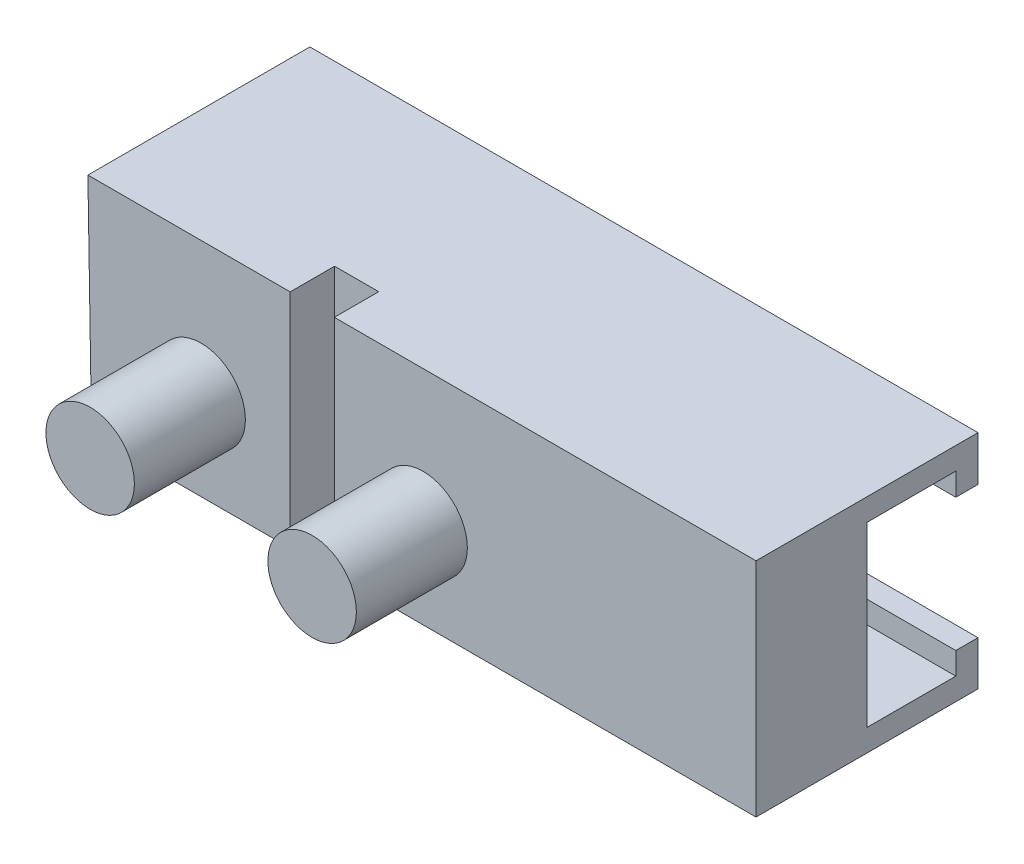
ISO-10303-21;
HEADER;
FILE_DESCRIPTION(('STEP AP214'),'2;1');
FILE_NAME('part.step','',(''),(''),'','','');
FILE_SCHEMA(('AUTOMOTIVE_DESIGN { 1 0 10303 214 1 1 1 1 }'));
ENDSEC;
DATA;
#1=APPLICATION_CONTEXT('core data for automotive mechanical design processes');
#2=APPLICATION_PROTOCOL_DEFINITION('international standard','automotive_design',2000,#1);
#3=PRODUCT_CONTEXT('',#1,'mechanical');
#4=PRODUCT('Part','Part','',(#3));
#5=PRODUCT_RELATED_PRODUCT_CATEGORY('part','',(#4));
#6=PRODUCT_DEFINITION_FORMATION('','',#4);
#7=PRODUCT_DEFINITION_CONTEXT('part definition',#1,'design');
#8=PRODUCT_DEFINITION('design','',#6,#7);
#9=PRODUCT_DEFINITION_SHAPE('','',#8);
#10=(LENGTH_UNIT() NAMED_UNIT(*) SI_UNIT(.MILLI.,.METRE.));
#11=(NAMED_UNIT(*) PLANE_ANGLE_UNIT() SI_UNIT($,.RADIAN.));
#12=(NAMED_UNIT(*) SI_UNIT($,.STERADIAN.) SOLID_ANGLE_UNIT());
#13=UNCERTAINTY_MEASURE_WITH_UNIT(LENGTH_MEASURE(1.E-05),#10,'distance_accuracy_value','');
#14=(GEOMETRIC_REPRESENTATION_CONTEXT(3) GLOBAL_UNCERTAINTY_ASSIGNED_CONTEXT((#13)) GLOBAL_UNIT_ASSIGNED_CONTEXT((#10,
#11,#12)) REPRESENTATION_CONTEXT('',''));
#15=CARTESIAN_POINT('',(0.,0.,0.));
#16=DIRECTION('',(0.,0.,1.));
#17=DIRECTION('',(1.,0.,0.));
#18=AXIS2_PLACEMENT_3D('',#15,#16,#17);
#19=CARTESIAN_POINT('',(-1.64213620169926,0.,4.99999988824129));
#20=DIRECTION('',(0.,0.,1.));
#21=DIRECTION('',(1.,0.,0.));
#22=AXIS2_PLACEMENT_3D('',#19,#20,#21);
#23=PLANE('',#22);
#24=DIRECTION('',(0.,1.,0.));
#25=VECTOR('',#24,1.);
#26=CARTESIAN_POINT('',(20.9999997168779,-2.81990806312765,4.99999988824129));
#27=LINE('',#26,#25);
#28=CARTESIAN_POINT('',(20.9999997168779,0.,4.99999988824129));
#29=VERTEX_POINT('',#28);
#30=CARTESIAN_POINT('',(20.9999997168779,9.99999977648258,4.99999988824129));
#31=VERTEX_POINT('',#30);
#32=EDGE_CURVE('E193',#29,#31,#27,.T.);
#33=ORIENTED_EDGE('',*,*,#32,.F.);
#34=DIRECTION('',(1.,0.,0.));
#35=VECTOR('',#34,1.);
#36=CARTESIAN_POINT('',(-1.64213620169926,0.,4.99999988824129));
#37=LINE('',#36,#35);
#38=CARTESIAN_POINT('',(39.9999991059303,0.,4.99999988824129));
#39=VERTEX_POINT('',#38);
#40=EDGE_CURVE('E252',#29,#39,#37,.T.);
#41=ORIENTED_EDGE('',*,*,#40,.T.);
#42=DIRECTION('',(0.,-1.,0.));
#43=VECTOR('',#42,1.);
#44=CARTESIAN_POINT('',(39.9999991059303,0.,4.99999988824129));
#45=LINE('',#44,#43);
#46=CARTESIAN_POINT('',(39.9999991059303,9.99999977648258,4.99999988824129));
#47=VERTEX_POINT('',#46);
#48=EDGE_CURVE('E247',#47,#39,#45,.T.);
#49=ORIENTED_EDGE('',*,*,#48,.F.);
#50=DIRECTION('',(1.,0.,0.));
#51=VECTOR('',#50,1.);
#52=CARTESIAN_POINT('',(-1.64213620169926,9.99999977648258,4.99999988824129));
#53=LINE('',#52,#51);
#54=EDGE_CURVE('E255',#31,#47,#53,.T.);
#55=ORIENTED_EDGE('',*,*,#54,.F.);
#56=EDGE_LOOP('',(#33,#41,#49,#55));
#57=FACE_BOUND('',#56,.T.);
#58=CARTESIAN_POINT('',(25.000000372529,3.99999984074384,4.99999988824129));
#59=DIRECTION('',(0.,0.,1.));
#60=DIRECTION('',(1.,0.,0.));
#61=AXIS2_PLACEMENT_3D('',#58,#59,#60);
#62=CIRCLE('',#61,1.99316896032542);
#63=CARTESIAN_POINT('',(26.9931693328544,3.99999984074384,4.99999988824129));
#64=VERTEX_POINT('',#63);
#65=EDGE_CURVE('E11',#64,#64,#62,.T.);
#66=ORIENTED_EDGE('',*,*,#65,.F.);
#67=EDGE_LOOP('',(#66));
#68=FACE_BOUND('',#67,.T.);
#69=ADVANCED_FACE('F43',(#57,#68),#23,.T.);
#70=CARTESIAN_POINT('',(39.9999991059303,0.,0.));
#71=DIRECTION('',(1.,0.,0.));
#72=DIRECTION('',(0.,0.,-1.));
#73=AXIS2_PLACEMENT_3D('',#70,#71,#72);
#74=PLANE('',#73);
#75=DIRECTION('',(0.,-1.,0.));
#76=VECTOR('',#75,1.);
#77=CARTESIAN_POINT('',(39.9999991059303,0.,-4.00000018998981));
#78=LINE('',#77,#76);
#79=CARTESIAN_POINT('',(39.9999991059303,8.99999961256981,-4.00000018998981));
#80=VERTEX_POINT('',#79);
#81=CARTESIAN_POINT('',(39.9999991059303,7.97875691205263,-4.00000018998981));
#82=VERTEX_POINT('',#81);
#83=EDGE_CURVE('E219',#80,#82,#78,.T.);
#84=ORIENTED_EDGE('',*,*,#83,.T.);
#85=DIRECTION('',(0.,0.,-1.));
#86=VECTOR('',#85,1.);
#87=CARTESIAN_POINT('',(39.9999991059303,7.97875691205263,0.));
#88=LINE('',#87,#86);
#89=CARTESIAN_POINT('',(39.9999991059303,7.97875691205263,-4.99999988824129));
#90=VERTEX_POINT('',#89);
#91=EDGE_CURVE('E250',#82,#90,#88,.T.);
#92=ORIENTED_EDGE('',*,*,#91,.T.);
#93=DIRECTION('',(0.,-1.,0.));
#94=VECTOR('',#93,1.);
#95=CARTESIAN_POINT('',(39.9999991059303,0.,-4.99999988824129));
#96=LINE('',#95,#94);
#97=CARTESIAN_POINT('',(39.9999991059303,9.99999977648258,-4.99999988824129));
#98=VERTEX_POINT('',#97);
#99=EDGE_CURVE('E169',#98,#90,#96,.T.);
#100=ORIENTED_EDGE('',*,*,#99,.F.);
#101=DIRECTION('',(0.,0.,-1.));
#102=VECTOR('',#101,1.);
#103=CARTESIAN_POINT('',(39.9999991059303,9.99999977648258,0.));
#104=LINE('',#103,#102);
#105=EDGE_CURVE('E164',#47,#98,#104,.T.);
#106=ORIENTED_EDGE('',*,*,#105,.F.);
#107=ORIENTED_EDGE('',*,*,#48,.T.);
#108=DIRECTION('',(0.,0.,-1.));
#109=VECTOR('',#108,1.);
#110=CARTESIAN_POINT('',(39.9999991059303,0.,0.));
#111=LINE('',#110,#109);
#112=CARTESIAN_POINT('',(39.9999991059303,0.,-4.99999988824129));
#113=VERTEX_POINT('',#112);
#114=EDGE_CURVE('E235',#39,#113,#111,.T.);
#115=ORIENTED_EDGE('',*,*,#114,.T.);
#116=DIRECTION('',(0.,-1.,0.));
#117=VECTOR('',#116,1.);
#118=CARTESIAN_POINT('',(39.9999991059303,0.,-4.99999988824129));
#119=LINE('',#118,#117);
#120=CARTESIAN_POINT('',(39.9999991059303,2.0000000949949,-4.99999988824129));
#121=VERTEX_POINT('',#120);
#122=EDGE_CURVE('E241',#121,#113,#119,.T.);
#123=ORIENTED_EDGE('',*,*,#122,.F.);
#124=DIRECTION('',(0.,0.,-1.));
#125=VECTOR('',#124,1.);
#126=CARTESIAN_POINT('',(39.9999991059303,2.0000000949949,0.));
#127=LINE('',#126,#125);
#128=CARTESIAN_POINT('',(39.9999991059303,2.0000000949949,-4.00000018998981));
#129=VERTEX_POINT('',#128);
#130=EDGE_CURVE('E236',#129,#121,#127,.T.);
#131=ORIENTED_EDGE('',*,*,#130,.F.);
#132=DIRECTION('',(0.,-1.,0.));
#133=VECTOR('',#132,1.);
#134=CARTESIAN_POINT('',(39.9999991059303,0.,-4.00000018998981));
#135=LINE('',#134,#133);
#136=CARTESIAN_POINT('',(39.9999991059303,1.00000004749745,-4.00000018998981));
#137=VERTEX_POINT('',#136);
#138=EDGE_CURVE('E223',#129,#137,#135,.T.);
#139=ORIENTED_EDGE('',*,*,#138,.T.);
#140=DIRECTION('',(0.,0.,-1.));
#141=VECTOR('',#140,1.);
#142=CARTESIAN_POINT('',(39.9999991059303,1.00000004749745,0.));
#143=LINE('',#142,#141);
#144=CARTESIAN_POINT('',(39.9999991059303,1.00000004749745,0.));
#145=VERTEX_POINT('',#144);
#146=EDGE_CURVE('E229',#145,#137,#143,.T.);
#147=ORIENTED_EDGE('',*,*,#146,.F.);
#148=DIRECTION('',(0.,-1.,0.));
#149=VECTOR('',#148,1.);
#150=CARTESIAN_POINT('',(39.9999991059303,0.,0.));
#151=LINE('',#150,#149);
#152=CARTESIAN_POINT('',(39.9999991059303,8.99999961256981,0.));
#153=VERTEX_POINT('',#152);
#154=EDGE_CURVE('E224',#153,#145,#151,.T.);
#155=ORIENTED_EDGE('',*,*,#154,.F.);
#156=DIRECTION('',(0.,0.,-1.));
#157=VECTOR('',#156,1.);
#158=CARTESIAN_POINT('',(39.9999991059303,8.99999961256981,0.));
#159=LINE('',#158,#157);
#160=EDGE_CURVE('E220',#153,#80,#159,.T.);
#161=ORIENTED_EDGE('',*,*,#160,.T.);
#162=EDGE_LOOP('',(#84,#92,#100,#106,#107,#115,#123,#131,#139,#147,#155,#161));
#163=FACE_BOUND('',#162,.T.);
#164=ADVANCED_FACE('F293',(#163),#74,.T.);
#165=CARTESIAN_POINT('',(-1.64213620169926,7.97875691205263,0.));
#166=DIRECTION('',(0.,-1.,0.));
#167=DIRECTION('',(0.,0.,-1.));
#168=AXIS2_PLACEMENT_3D('',#165,#166,#167);
#169=PLANE('',#168);
#170=DIRECTION('',(1.,0.,0.));
#171=VECTOR('',#170,1.);
#172=CARTESIAN_POINT('',(-1.64213620169926,7.97875691205263,-4.00000018998981));
#173=LINE('',#172,#171);
#174=CARTESIAN_POINT('',(9.93202454081561,7.97875691205263,-4.00000018998981));
#175=VERTEX_POINT('',#174);
#176=EDGE_CURVE('E66',#175,#82,#173,.T.);
#177=ORIENTED_EDGE('',*,*,#176,.F.);
#178=DIRECTION('',(0.,0.,-1.));
#179=VECTOR('',#178,1.);
#180=CARTESIAN_POINT('',(9.93202454081562,7.97875691205263,-4.99999988824129));
#181=LINE('',#180,#179);
#182=CARTESIAN_POINT('',(9.93202454081562,7.97875691205263,-4.99999988824129));
#183=VERTEX_POINT('',#182);
#184=EDGE_CURVE('E188',#175,#183,#181,.T.);
#185=ORIENTED_EDGE('',*,*,#184,.T.);
#186=DIRECTION('',(1.,0.,0.));
#187=VECTOR('',#186,1.);
#188=CARTESIAN_POINT('',(-1.64213620169926,7.97875691205263,-4.99999988824129));
#189=LINE('',#188,#187);
#190=EDGE_CURVE('E170',#183,#90,#189,.T.);
#191=ORIENTED_EDGE('',*,*,#190,.T.);
#192=ORIENTED_EDGE('',*,*,#91,.F.);
#193=EDGE_LOOP('',(#177,#185,#191,#192));
#194=FACE_BOUND('',#193,.T.);
#195=ADVANCED_FACE('F45',(#194),#169,.T.);
#196=CARTESIAN_POINT('',(-1.64213620169926,0.,-4.99999988824129));
#197=DIRECTION('',(0.,0.,1.));
#198=DIRECTION('',(1.,0.,0.));
#199=AXIS2_PLACEMENT_3D('',#196,#197,#198);
#200=PLANE('',#199);
#201=ORIENTED_EDGE('',*,*,#190,.F.);
#202=DIRECTION('',(-0.0165650611449048,0.999862789961335,0.));
#203=VECTOR('',#202,1.);
#204=CARTESIAN_POINT('',(9.89467977908192,10.2328770345721,-4.99999988824129));
#205=LINE('',#204,#203);
#206=CARTESIAN_POINT('',(9.89853793447908,9.99999977648258,-4.99999988824129));
#207=VERTEX_POINT('',#206);
#208=EDGE_CURVE('E178',#183,#207,#205,.T.);
#209=ORIENTED_EDGE('',*,*,#208,.T.);
#210=DIRECTION('',(1.,0.,0.));
#211=VECTOR('',#210,1.);
#212=CARTESIAN_POINT('',(-1.64213620169926,9.99999977648258,-4.99999988824129));
#213=LINE('',#212,#211);
#214=EDGE_CURVE('E157',#207,#98,#213,.T.);
#215=ORIENTED_EDGE('',*,*,#214,.T.);
#216=ORIENTED_EDGE('',*,*,#99,.T.);
#217=EDGE_LOOP('',(#201,#209,#215,#216));
#218=FACE_BOUND('',#217,.T.);
#219=ADVANCED_FACE('F184',(#218),#200,.F.);
#220=CARTESIAN_POINT('',(-1.64213620169926,9.99999977648258,0.));
#221=DIRECTION('',(0.,-1.,0.));
#222=DIRECTION('',(0.,0.,-1.));
#223=AXIS2_PLACEMENT_3D('',#220,#221,#222);
#224=PLANE('',#223);
#225=DIRECTION('',(-1.,0.,0.));
#226=VECTOR('',#225,1.);
#227=CARTESIAN_POINT('',(19.0120656043291,9.99999977648258,3.00000002607703));
#228=LINE('',#227,#226);
#229=CARTESIAN_POINT('',(20.9999997168779,9.99999977648258,3.00000002607703));
#230=VERTEX_POINT('',#229);
#231=CARTESIAN_POINT('',(19.0120656043291,9.99999977648258,3.00000002607703));
#232=VERTEX_POINT('',#231);
#233=EDGE_CURVE('E190',#230,#232,#228,.T.);
#234=ORIENTED_EDGE('',*,*,#233,.F.);
#235=DIRECTION('',(0.,0.,-1.));
#236=VECTOR('',#235,1.);
#237=CARTESIAN_POINT('',(20.9999997168779,9.99999977648258,4.99999988824129));
#238=LINE('',#237,#236);
#239=EDGE_CURVE('E194',#31,#230,#238,.T.);
#240=ORIENTED_EDGE('',*,*,#239,.F.);
#241=ORIENTED_EDGE('',*,*,#54,.T.);
#242=ORIENTED_EDGE('',*,*,#105,.T.);
#243=ORIENTED_EDGE('',*,*,#214,.F.);
#244=DIRECTION('',(0.,0.,1.));
#245=VECTOR('',#244,1.);
#246=CARTESIAN_POINT('',(9.89853793447908,9.99999977648258,4.99999988824129));
#247=LINE('',#246,#245);
#248=CARTESIAN_POINT('',(9.89853793447908,9.99999977648258,4.99999988824129));
#249=VERTEX_POINT('',#248);
#250=EDGE_CURVE('E162',#207,#249,#247,.T.);
#251=ORIENTED_EDGE('',*,*,#250,.T.);
#252=CARTESIAN_POINT('',(19.0120656043291,9.99999977648258,4.99999988824129));
#253=VERTEX_POINT('',#252);
#254=EDGE_CURVE('E253',#249,#253,#53,.T.);
#255=ORIENTED_EDGE('',*,*,#254,.T.);
#256=DIRECTION('',(0.,0.,1.));
#257=VECTOR('',#256,1.);
#258=CARTESIAN_POINT('',(19.0120656043291,9.99999977648258,4.99999988824129));
#259=LINE('',#258,#257);
#260=EDGE_CURVE('E197',#232,#253,#259,.T.);
#261=ORIENTED_EDGE('',*,*,#260,.F.);
#262=EDGE_LOOP('',(#234,#240,#241,#242,#243,#251,#255,#261));
#263=FACE_BOUND('',#262,.T.);
#264=ADVANCED_FACE('F160',(#263),#224,.F.);
#265=DIRECTION('',(0.,1.,0.));
#266=VECTOR('',#265,1.);
#267=CARTESIAN_POINT('',(19.0120656043291,-2.81990806312765,4.99999988824129));
#268=LINE('',#267,#266);
#269=CARTESIAN_POINT('',(19.0120656043291,0.,4.99999988824129));
#270=VERTEX_POINT('',#269);
#271=EDGE_CURVE('E58',#270,#253,#268,.T.);
#272=ORIENTED_EDGE('',*,*,#271,.T.);
#273=ORIENTED_EDGE('',*,*,#254,.F.);
#274=DIRECTION('',(0.0165650611449048,-0.999862789961335,0.));
#275=VECTOR('',#274,1.);
#276=CARTESIAN_POINT('',(10.0603076579021,0.235621270535495,4.99999988824129));
#277=LINE('',#276,#275);
#278=CARTESIAN_POINT('',(10.0642112742709,0.,4.99999988824129));
#279=VERTEX_POINT('',#278);
#280=EDGE_CURVE('E182',#249,#279,#277,.T.);
#281=ORIENTED_EDGE('',*,*,#280,.T.);
#282=EDGE_CURVE('E268',#279,#270,#37,.T.);
#283=ORIENTED_EDGE('',*,*,#282,.T.);
#284=EDGE_LOOP('',(#272,#273,#281,#283));
#285=FACE_BOUND('',#284,.T.);
#286=CARTESIAN_POINT('',(14.9999996647239,3.99999984074384,4.99999988824129));
#287=DIRECTION('',(0.,0.,1.));
#288=DIRECTION('',(1.,0.,0.));
#289=AXIS2_PLACEMENT_3D('',#286,#287,#288);
#290=CIRCLE('',#289,1.99316896032542);
#291=CARTESIAN_POINT('',(16.9931686250493,3.99999984074384,4.99999988824129));
#292=VERTEX_POINT('',#291);
#293=EDGE_CURVE('E51',#292,#292,#290,.T.);
#294=ORIENTED_EDGE('',*,*,#293,.F.);
#295=EDGE_LOOP('',(#294));
#296=FACE_BOUND('',#295,.T.);
#297=ADVANCED_FACE('F279',(#285,#296),#23,.T.);
#298=CARTESIAN_POINT('',(-1.64213620169926,0.,0.));
#299=DIRECTION('',(0.,-1.,0.));
#300=DIRECTION('',(0.,0.,-1.));
#301=AXIS2_PLACEMENT_3D('',#298,#299,#300);
#302=PLANE('',#301);
#303=DIRECTION('',(0.,0.,-1.));
#304=VECTOR('',#303,1.);
#305=CARTESIAN_POINT('',(20.9999997168779,0.,4.99999988824129));
#306=LINE('',#305,#304);
#307=CARTESIAN_POINT('',(20.9999997168779,0.,3.00000002607703));
#308=VERTEX_POINT('',#307);
#309=EDGE_CURVE('E206',#29,#308,#306,.T.);
#310=ORIENTED_EDGE('',*,*,#309,.T.);
#311=DIRECTION('',(-1.,0.,0.));
#312=VECTOR('',#311,1.);
#313=CARTESIAN_POINT('',(19.0120656043291,0.,3.00000002607703));
#314=LINE('',#313,#312);
#315=CARTESIAN_POINT('',(19.0120656043291,0.,3.00000002607703));
#316=VERTEX_POINT('',#315);
#317=EDGE_CURVE('E202',#308,#316,#314,.T.);
#318=ORIENTED_EDGE('',*,*,#317,.T.);
#319=DIRECTION('',(0.,0.,1.));
#320=VECTOR('',#319,1.);
#321=CARTESIAN_POINT('',(19.0120656043291,0.,4.99999988824129));
#322=LINE('',#321,#320);
#323=EDGE_CURVE('E199',#316,#270,#322,.T.);
#324=ORIENTED_EDGE('',*,*,#323,.T.);
#325=ORIENTED_EDGE('',*,*,#282,.F.);
#326=DIRECTION('',(0.,0.,-1.));
#327=VECTOR('',#326,1.);
#328=CARTESIAN_POINT('',(10.0642112742709,0.,-4.99999988824129));
#329=LINE('',#328,#327);
#330=CARTESIAN_POINT('',(10.0642112742709,0.,-4.99999988824129));
#331=VERTEX_POINT('',#330);
#332=EDGE_CURVE('E364',#279,#331,#329,.T.);
#333=ORIENTED_EDGE('',*,*,#332,.T.);
#334=DIRECTION('',(1.,0.,0.));
#335=VECTOR('',#334,1.);
#336=CARTESIAN_POINT('',(-1.64213620169926,0.,-4.99999988824129));
#337=LINE('',#336,#335);
#338=EDGE_CURVE('E266',#331,#113,#337,.T.);
#339=ORIENTED_EDGE('',*,*,#338,.T.);
#340=ORIENTED_EDGE('',*,*,#114,.F.);
#341=ORIENTED_EDGE('',*,*,#40,.F.);
#342=EDGE_LOOP('',(#310,#318,#324,#325,#333,#339,#340,#341));
#343=FACE_BOUND('',#342,.T.);
#344=ADVANCED_FACE('F281',(#343),#302,.T.);
#345=CARTESIAN_POINT('',(-1.64213620169926,0.,-4.99999988824129));
#346=DIRECTION('',(0.,0.,1.));
#347=DIRECTION('',(1.,0.,0.));
#348=AXIS2_PLACEMENT_3D('',#345,#346,#347);
#349=PLANE('',#348);
#350=ORIENTED_EDGE('',*,*,#338,.F.);
#351=DIRECTION('',(-0.0165650611449048,0.999862789961335,0.));
#352=VECTOR('',#351,1.);
#353=CARTESIAN_POINT('',(10.0271820798243,2.23507256300286,-4.99999988824129));
#354=LINE('',#353,#352);
#355=CARTESIAN_POINT('',(10.0310766039981,2.0000000949949,-4.99999988824129));
#356=VERTEX_POINT('',#355);
#357=EDGE_CURVE('E359',#331,#356,#354,.T.);
#358=ORIENTED_EDGE('',*,*,#357,.T.);
#359=DIRECTION('',(1.,0.,0.));
#360=VECTOR('',#359,1.);
#361=CARTESIAN_POINT('',(-1.64213620169926,2.0000000949949,-4.99999988824129));
#362=LINE('',#361,#360);
#363=EDGE_CURVE('E244',#356,#121,#362,.T.);
#364=ORIENTED_EDGE('',*,*,#363,.T.);
#365=ORIENTED_EDGE('',*,*,#122,.T.);
#366=EDGE_LOOP('',(#350,#358,#364,#365));
#367=FACE_BOUND('',#366,.T.);
#368=ADVANCED_FACE('F288',(#367),#349,.F.);
#369=CARTESIAN_POINT('',(-1.64213620169926,2.0000000949949,0.));
#370=DIRECTION('',(0.,-1.,0.));
#371=DIRECTION('',(0.,0.,-1.));
#372=AXIS2_PLACEMENT_3D('',#369,#370,#371);
#373=PLANE('',#372);
#374=ORIENTED_EDGE('',*,*,#363,.F.);
#375=DIRECTION('',(0.,0.,1.));
#376=VECTOR('',#375,1.);
#377=CARTESIAN_POINT('',(10.0310766039981,2.0000000949949,-4.00000018998981));
#378=LINE('',#377,#376);
#379=CARTESIAN_POINT('',(10.0310766039981,2.0000000949949,-4.00000018998981));
#380=VERTEX_POINT('',#379);
#381=EDGE_CURVE('E367',#356,#380,#378,.T.);
#382=ORIENTED_EDGE('',*,*,#381,.T.);
#383=DIRECTION('',(1.,0.,0.));
#384=VECTOR('',#383,1.);
#385=CARTESIAN_POINT('',(-1.64213620169926,2.0000000949949,-4.00000018998981));
#386=LINE('',#385,#384);
#387=EDGE_CURVE('E240',#380,#129,#386,.T.);
#388=ORIENTED_EDGE('',*,*,#387,.T.);
#389=ORIENTED_EDGE('',*,*,#130,.T.);
#390=EDGE_LOOP('',(#374,#382,#388,#389));
#391=FACE_BOUND('',#390,.T.);
#392=ADVANCED_FACE('F348',(#391),#373,.F.);
#393=CARTESIAN_POINT('',(-1.64213620169926,0.,-4.00000018998981));
#394=DIRECTION('',(0.,0.,1.));
#395=DIRECTION('',(1.,0.,0.));
#396=AXIS2_PLACEMENT_3D('',#393,#394,#395);
#397=PLANE('',#396);
#398=ORIENTED_EDGE('',*,*,#387,.F.);
#399=DIRECTION('',(0.0165650611449048,-0.999862789961335,0.));
#400=VECTOR('',#399,1.);
#401=CARTESIAN_POINT('',(10.0437448688632,1.23534691676918,-4.00000018998981));
#402=LINE('',#401,#400);
#403=CARTESIAN_POINT('',(10.0476439391345,1.00000004749745,-4.00000018998981));
#404=VERTEX_POINT('',#403);
#405=EDGE_CURVE('E373',#380,#404,#402,.T.);
#406=ORIENTED_EDGE('',*,*,#405,.T.);
#407=DIRECTION('',(1.,0.,0.));
#408=VECTOR('',#407,1.);
#409=CARTESIAN_POINT('',(-1.64213620169926,1.00000004749745,-4.00000018998981));
#410=LINE('',#409,#408);
#411=EDGE_CURVE('E239',#404,#137,#410,.T.);
#412=ORIENTED_EDGE('',*,*,#411,.T.);
#413=ORIENTED_EDGE('',*,*,#138,.F.);
#414=EDGE_LOOP('',(#398,#406,#412,#413));
#415=FACE_BOUND('',#414,.T.);
#416=ADVANCED_FACE('F344',(#415),#397,.T.);
#417=CARTESIAN_POINT('',(-1.64213620169926,1.00000004749745,0.));
#418=DIRECTION('',(0.,-1.,0.));
#419=DIRECTION('',(0.,0.,-1.));
#420=AXIS2_PLACEMENT_3D('',#417,#418,#419);
#421=PLANE('',#420);
#422=ORIENTED_EDGE('',*,*,#411,.F.);
#423=DIRECTION('',(0.,0.,1.));
#424=VECTOR('',#423,1.);
#425=CARTESIAN_POINT('',(10.0476439391345,1.00000004749745,0.));
#426=LINE('',#425,#424);
#427=CARTESIAN_POINT('',(10.0476439391345,1.00000004749745,0.));
#428=VERTEX_POINT('',#427);
#429=EDGE_CURVE('E376',#404,#428,#426,.T.);
#430=ORIENTED_EDGE('',*,*,#429,.T.);
#431=DIRECTION('',(1.,0.,0.));
#432=VECTOR('',#431,1.);
#433=CARTESIAN_POINT('',(-1.64213620169926,1.00000004749745,0.));
#434=LINE('',#433,#432);
#435=EDGE_CURVE('E232',#428,#145,#434,.T.);
#436=ORIENTED_EDGE('',*,*,#435,.T.);
#437=ORIENTED_EDGE('',*,*,#146,.T.);
#438=EDGE_LOOP('',(#422,#430,#436,#437));
#439=FACE_BOUND('',#438,.T.);
#440=ADVANCED_FACE('F340',(#439),#421,.F.);
#441=CARTESIAN_POINT('',(-1.64213620169926,0.,0.));
#442=DIRECTION('',(0.,0.,1.));
#443=DIRECTION('',(1.,0.,0.));
#444=AXIS2_PLACEMENT_3D('',#441,#442,#443);
#445=PLANE('',#444);
#446=ORIENTED_EDGE('',*,*,#435,.F.);
#447=DIRECTION('',(-0.0165650611449048,0.999862789961335,0.));
#448=VECTOR('',#447,1.);
#449=CARTESIAN_POINT('',(9.91124257004899,9.23315127195501,0.));
#450=LINE('',#449,#448);
#451=CARTESIAN_POINT('',(9.91510527154417,8.99999961256981,0.));
#452=VERTEX_POINT('',#451);
#453=EDGE_CURVE('E379',#428,#452,#450,.T.);
#454=ORIENTED_EDGE('',*,*,#453,.T.);
#455=DIRECTION('',(1.,0.,0.));
#456=VECTOR('',#455,1.);
#457=CARTESIAN_POINT('',(-1.64213620169926,8.99999961256981,0.));
#458=LINE('',#457,#456);
#459=EDGE_CURVE('E228',#452,#153,#458,.T.);
#460=ORIENTED_EDGE('',*,*,#459,.T.);
#461=ORIENTED_EDGE('',*,*,#154,.T.);
#462=EDGE_LOOP('',(#446,#454,#460,#461));
#463=FACE_BOUND('',#462,.T.);
#464=ADVANCED_FACE('F336',(#463),#445,.F.);
#465=CARTESIAN_POINT('',(-1.64213620169926,8.99999961256981,0.));
#466=DIRECTION('',(0.,-1.,0.));
#467=DIRECTION('',(0.,0.,-1.));
#468=AXIS2_PLACEMENT_3D('',#465,#466,#467);
#469=PLANE('',#468);
#470=ORIENTED_EDGE('',*,*,#459,.F.);
#471=DIRECTION('',(0.,0.,-1.));
#472=VECTOR('',#471,1.);
#473=CARTESIAN_POINT('',(9.91510527154417,8.99999961256981,-4.00000018998981));
#474=LINE('',#473,#472);
#475=CARTESIAN_POINT('',(9.91510527154417,8.99999961256981,-4.00000018998981));
#476=VERTEX_POINT('',#475);
#477=EDGE_CURVE('E382',#452,#476,#474,.T.);
#478=ORIENTED_EDGE('',*,*,#477,.T.);
#479=DIRECTION('',(1.,0.,0.));
#480=VECTOR('',#479,1.);
#481=CARTESIAN_POINT('',(-1.64213620169926,8.99999961256981,-4.00000018998981));
#482=LINE('',#481,#480);
#483=EDGE_CURVE('E227',#476,#80,#482,.T.);
#484=ORIENTED_EDGE('',*,*,#483,.T.);
#485=ORIENTED_EDGE('',*,*,#160,.F.);
#486=EDGE_LOOP('',(#470,#478,#484,#485));
#487=FACE_BOUND('',#486,.T.);
#488=ADVANCED_FACE('F333',(#487),#469,.T.);
#489=CARTESIAN_POINT('',(-1.64213620169926,0.,-4.00000018998981));
#490=DIRECTION('',(0.,0.,1.));
#491=DIRECTION('',(1.,0.,0.));
#492=AXIS2_PLACEMENT_3D('',#489,#490,#491);
#493=PLANE('',#492);
#494=ORIENTED_EDGE('',*,*,#483,.F.);
#495=DIRECTION('',(0.0165650611449048,-0.999862789961335,0.));
#496=VECTOR('',#495,1.);
#497=CARTESIAN_POINT('',(9.92815719665179,8.21218880171215,-4.00000018998981));
#498=LINE('',#497,#496);
#499=EDGE_CURVE('E384',#476,#175,#498,.T.);
#500=ORIENTED_EDGE('',*,*,#499,.T.);
#501=ORIENTED_EDGE('',*,*,#176,.T.);
#502=ORIENTED_EDGE('',*,*,#83,.F.);
#503=EDGE_LOOP('',(#494,#500,#501,#502));
#504=FACE_BOUND('',#503,.T.);
#505=ADVANCED_FACE('F329',(#504),#493,.T.);
#506=CARTESIAN_POINT('',(14.9999996647239,3.99999984074384,-0.637533263345289));
#507=DIRECTION('',(0.,0.,1.));
#508=DIRECTION('',(1.,0.,0.));
#509=AXIS2_PLACEMENT_3D('',#506,#507,#508);
#510=CYLINDRICAL_SURFACE('',#509,1.99316896032542);
#511=ORIENTED_EDGE('',*,*,#293,.T.);
#512=EDGE_LOOP('',(#511));
#513=FACE_BOUND('',#512,.T.);
#514=CARTESIAN_POINT('',(14.9999996647239,3.99999984074384,9.99999977648258));
#515=DIRECTION('',(0.,0.,1.));
#516=DIRECTION('',(1.,0.,0.));
#517=AXIS2_PLACEMENT_3D('',#514,#515,#516);
#518=CIRCLE('',#517,1.99316896032542);
#519=CARTESIAN_POINT('',(16.9931686250493,3.99999984074384,9.99999977648258));
#520=VERTEX_POINT('',#519);
#521=EDGE_CURVE('E216',#520,#520,#518,.T.);
#522=ORIENTED_EDGE('',*,*,#521,.F.);
#523=EDGE_LOOP('',(#522));
#524=FACE_BOUND('',#523,.T.);
#525=ADVANCED_FACE('F276',(#513,#524),#510,.T.);
#526=CARTESIAN_POINT('',(0.,0.,9.99999977648258));
#527=DIRECTION('',(0.,0.,1.));
#528=DIRECTION('',(1.,0.,0.));
#529=AXIS2_PLACEMENT_3D('',#526,#527,#528);
#530=PLANE('',#529);
#531=ORIENTED_EDGE('',*,*,#521,.T.);
#532=EDGE_LOOP('',(#531));
#533=FACE_BOUND('',#532,.T.);
#534=ADVANCED_FACE('F310',(#533),#530,.T.);
#535=CARTESIAN_POINT('',(25.000000372529,3.99999984074384,-0.637533263345289));
#536=DIRECTION('',(0.,0.,1.));
#537=DIRECTION('',(1.,0.,0.));
#538=AXIS2_PLACEMENT_3D('',#535,#536,#537);
#539=CYLINDRICAL_SURFACE('',#538,1.99316896032542);
#540=ORIENTED_EDGE('',*,*,#65,.T.);
#541=EDGE_LOOP('',(#540));
#542=FACE_BOUND('',#541,.T.);
#543=CARTESIAN_POINT('',(25.000000372529,3.99999984074384,9.99999977648258));
#544=DIRECTION('',(0.,0.,1.));
#545=DIRECTION('',(1.,0.,0.));
#546=AXIS2_PLACEMENT_3D('',#543,#544,#545);
#547=CIRCLE('',#546,1.99316896032542);
#548=CARTESIAN_POINT('',(26.9931693328544,3.99999984074384,9.99999977648258));
#549=VERTEX_POINT('',#548);
#550=EDGE_CURVE('E213',#549,#549,#547,.T.);
#551=ORIENTED_EDGE('',*,*,#550,.F.);
#552=EDGE_LOOP('',(#551));
#553=FACE_BOUND('',#552,.T.);
#554=ADVANCED_FACE('F306',(#542,#553),#539,.T.);
#555=CARTESIAN_POINT('',(0.,0.,9.99999977648258));
#556=DIRECTION('',(0.,0.,1.));
#557=DIRECTION('',(1.,0.,0.));
#558=AXIS2_PLACEMENT_3D('',#555,#556,#557);
#559=PLANE('',#558);
#560=ORIENTED_EDGE('',*,*,#550,.T.);
#561=EDGE_LOOP('',(#560));
#562=FACE_BOUND('',#561,.T.);
#563=ADVANCED_FACE('F309',(#562),#559,.T.);
#564=CARTESIAN_POINT('',(20.9999997168779,-2.81990806312765,4.99999988824129));
#565=DIRECTION('',(1.,0.,0.));
#566=DIRECTION('',(0.,0.,-1.));
#567=AXIS2_PLACEMENT_3D('',#564,#565,#566);
#568=PLANE('',#567);
#569=ORIENTED_EDGE('',*,*,#32,.T.);
#570=ORIENTED_EDGE('',*,*,#239,.T.);
#571=DIRECTION('',(0.,1.,0.));
#572=VECTOR('',#571,1.);
#573=CARTESIAN_POINT('',(20.9999997168779,-2.81990806312765,3.00000002607703));
#574=LINE('',#573,#572);
#575=EDGE_CURVE('E205',#308,#230,#574,.T.);
#576=ORIENTED_EDGE('',*,*,#575,.F.);
#577=ORIENTED_EDGE('',*,*,#309,.F.);
#578=EDGE_LOOP('',(#569,#570,#576,#577));
#579=FACE_BOUND('',#578,.T.);
#580=ADVANCED_FACE('F315',(#579),#568,.F.);
#581=CARTESIAN_POINT('',(19.0120656043291,-2.81990806312765,3.00000002607703));
#582=DIRECTION('',(0.,0.,-1.));
#583=DIRECTION('',(-1.,0.,0.));
#584=AXIS2_PLACEMENT_3D('',#581,#582,#583);
#585=PLANE('',#584);
#586=ORIENTED_EDGE('',*,*,#575,.T.);
#587=ORIENTED_EDGE('',*,*,#233,.T.);
#588=DIRECTION('',(0.,1.,0.));
#589=VECTOR('',#588,1.);
#590=CARTESIAN_POINT('',(19.0120656043291,-2.81990806312765,3.00000002607703));
#591=LINE('',#590,#589);
#592=EDGE_CURVE('E201',#316,#232,#591,.T.);
#593=ORIENTED_EDGE('',*,*,#592,.F.);
#594=ORIENTED_EDGE('',*,*,#317,.F.);
#595=EDGE_LOOP('',(#586,#587,#593,#594));
#596=FACE_BOUND('',#595,.T.);
#597=ADVANCED_FACE('F320',(#596),#585,.F.);
#598=CARTESIAN_POINT('',(19.0120656043291,-2.81990806312765,4.99999988824129));
#599=DIRECTION('',(-1.,0.,0.));
#600=DIRECTION('',(0.,0.,1.));
#601=AXIS2_PLACEMENT_3D('',#598,#599,#600);
#602=PLANE('',#601);
#603=ORIENTED_EDGE('',*,*,#592,.T.);
#604=ORIENTED_EDGE('',*,*,#260,.T.);
#605=ORIENTED_EDGE('',*,*,#271,.F.);
#606=ORIENTED_EDGE('',*,*,#323,.F.);
#607=EDGE_LOOP('',(#603,#604,#605,#606));
#608=FACE_BOUND('',#607,.T.);
#609=ADVANCED_FACE('F400',(#608),#602,.F.);
#610=CARTESIAN_POINT('',(9.92751574795693,8.25090647839628,8.39999988824129));
#611=DIRECTION('',(0.999862789961335,0.0165650611449048,0.));
#612=DIRECTION('',(-0.0165650611449048,0.999862789961335,0.));
#613=AXIS2_PLACEMENT_3D('',#610,#611,#612);
#614=PLANE('',#613);
#615=ORIENTED_EDGE('',*,*,#499,.F.);
#616=ORIENTED_EDGE('',*,*,#477,.F.);
#617=ORIENTED_EDGE('',*,*,#453,.F.);
#618=ORIENTED_EDGE('',*,*,#429,.F.);
#619=ORIENTED_EDGE('',*,*,#405,.F.);
#620=ORIENTED_EDGE('',*,*,#381,.F.);
#621=ORIENTED_EDGE('',*,*,#357,.F.);
#622=ORIENTED_EDGE('',*,*,#332,.F.);
#623=ORIENTED_EDGE('',*,*,#280,.F.);
#624=ORIENTED_EDGE('',*,*,#250,.F.);
#625=ORIENTED_EDGE('',*,*,#208,.F.);
#626=ORIENTED_EDGE('',*,*,#184,.F.);
#627=EDGE_LOOP('',(#615,#616,#617,#618,#619,#620,#621,#622,#623,#624,#625,#626));
#628=FACE_BOUND('',#627,.T.);
#629=ADVANCED_FACE('F176',(#628),#614,.F.);
#630=CLOSED_SHELL('',(#69,#164,#195,#219,#264,#297,#344,#368,#392,#416,#440,#464,#488,#505,#525,
#534,#554,#563,#580,#597,#609,#629));
#631=MANIFOLD_SOLID_BREP('B2',#630);
#632=ADVANCED_BREP_SHAPE_REPRESENTATION('',(#18,#631),#14);
#633=SHAPE_DEFINITION_REPRESENTATION(#9,#632);
ENDSEC;
END-ISO-10303-21;
